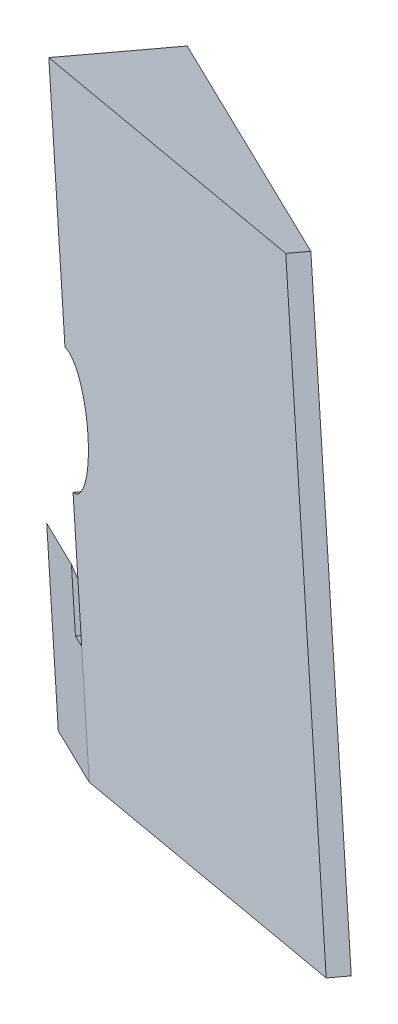
ISO-10303-21;
HEADER;
FILE_DESCRIPTION(('STEP AP214'),'2;1');
FILE_NAME('part.step','',(''),(''),'','','');
FILE_SCHEMA(('AUTOMOTIVE_DESIGN { 1 0 10303 214 1 1 1 1 }'));
ENDSEC;
DATA;
#1=APPLICATION_CONTEXT('core data for automotive mechanical design processes');
#2=APPLICATION_PROTOCOL_DEFINITION('international standard','automotive_design',2000,#1);
#3=PRODUCT_CONTEXT('',#1,'mechanical');
#4=PRODUCT('Part','Part','',(#3));
#5=PRODUCT_RELATED_PRODUCT_CATEGORY('part','',(#4));
#6=PRODUCT_DEFINITION_FORMATION('','',#4);
#7=PRODUCT_DEFINITION_CONTEXT('part definition',#1,'design');
#8=PRODUCT_DEFINITION('design','',#6,#7);
#9=PRODUCT_DEFINITION_SHAPE('','',#8);
#10=(LENGTH_UNIT() NAMED_UNIT(*) SI_UNIT(.MILLI.,.METRE.));
#11=(NAMED_UNIT(*) PLANE_ANGLE_UNIT() SI_UNIT($,.RADIAN.));
#12=(NAMED_UNIT(*) SI_UNIT($,.STERADIAN.) SOLID_ANGLE_UNIT());
#13=UNCERTAINTY_MEASURE_WITH_UNIT(LENGTH_MEASURE(1.E-05),#10,'distance_accuracy_value','');
#14=(GEOMETRIC_REPRESENTATION_CONTEXT(3) GLOBAL_UNCERTAINTY_ASSIGNED_CONTEXT((#13)) GLOBAL_UNIT_ASSIGNED_CONTEXT((#10,
#11,#12)) REPRESENTATION_CONTEXT('',''));
#15=CARTESIAN_POINT('',(0.,0.,0.));
#16=DIRECTION('',(0.,0.,1.));
#17=DIRECTION('',(1.,0.,0.));
#18=AXIS2_PLACEMENT_3D('',#15,#16,#17);
#19=CARTESIAN_POINT('',(174.868312652349,387.508814436363,117.368276724493));
#20=DIRECTION('',(0.741718760558882,0.378073109630995,0.553998198561101));
#21=DIRECTION('',(-0.598415116809022,0.,0.80118621304566));
#22=AXIS2_PLACEMENT_3D('',#19,#20,#21);
#23=PLANE('',#22);
#24=DIRECTION('',(-0.302906962959654,0.92577574162102,-0.226244664062182));
#25=VECTOR('',#24,1.);
#26=CARTESIAN_POINT('',(162.824516094883,388.577197507518,132.763963871476));
#27=LINE('',#26,#25);
#28=CARTESIAN_POINT('',(155.554748983851,410.795815306422,127.334091933984));
#29=VERTEX_POINT('',#28);
#30=CARTESIAN_POINT('',(150.708237576496,425.608227172359,123.714177308989));
#31=VERTEX_POINT('',#30);
#32=EDGE_CURVE('E205',#29,#31,#27,.T.);
#33=ORIENTED_EDGE('',*,*,#32,.T.);
#34=DIRECTION('',(0.598415116809022,0.,-0.801186213045659));
#35=VECTOR('',#34,1.);
#36=CARTESIAN_POINT('',(150.708237576496,425.608227172359,123.714177308989));
#37=LINE('',#36,#35);
#38=CARTESIAN_POINT('',(155.196350952564,425.608227172359,117.705280711146));
#39=VERTEX_POINT('',#38);
#40=EDGE_CURVE('E200',#31,#39,#37,.T.);
#41=ORIENTED_EDGE('',*,*,#40,.T.);
#42=DIRECTION('',(0.302906962959654,-0.92577574162102,0.226244664062182));
#43=VECTOR('',#42,1.);
#44=CARTESIAN_POINT('',(155.196350952564,425.608227172359,117.705280711146));
#45=LINE('',#44,#43);
#46=CARTESIAN_POINT('',(160.042862359919,410.795815306422,121.325195336141));
#47=VERTEX_POINT('',#46);
#48=EDGE_CURVE('E195',#39,#47,#45,.T.);
#49=ORIENTED_EDGE('',*,*,#48,.T.);
#50=DIRECTION('',(0.598415116809022,0.,-0.80118621304566));
#51=VECTOR('',#50,1.);
#52=CARTESIAN_POINT('',(130.122106519467,410.795815306422,161.384505988424));
#53=LINE('',#52,#51);
#54=EDGE_CURVE('E210',#29,#47,#53,.T.);
#55=ORIENTED_EDGE('',*,*,#54,.F.);
#56=EDGE_LOOP('',(#33,#41,#49,#55));
#57=FACE_BOUND('',#56,.T.);
#58=ADVANCED_FACE('F43',(#57),#23,.F.);
#59=CARTESIAN_POINT('',(181.27194031033,398.741323632892,96.6165838845008));
#60=DIRECTION('',(-0.741718760558882,-0.378073109630995,-0.553998198561101));
#61=DIRECTION('',(0.598415116809022,0.,-0.80118621304566));
#62=AXIS2_PLACEMENT_3D('',#59,#60,#61);
#63=PLANE('',#62);
#64=DIRECTION('',(0.598415116809022,0.,-0.80118621304566));
#65=VECTOR('',#64,1.);
#66=CARTESIAN_POINT('',(163.186530347356,394.575332795598,123.673236796765));
#67=LINE('',#66,#65);
#68=CARTESIAN_POINT('',(158.698416971288,394.575332795598,129.682133394607));
#69=VERTEX_POINT('',#68);
#70=CARTESIAN_POINT('',(159.559546773102,394.575332795598,128.52921244479));
#71=VERTEX_POINT('',#70);
#72=EDGE_CURVE('E174',#69,#71,#67,.T.);
#73=ORIENTED_EDGE('',*,*,#72,.T.);
#74=DIRECTION('',(-0.489309461897122,0.869944632903876,0.0614213821050018));
#75=VECTOR('',#74,1.);
#76=CARTESIAN_POINT('',(157.203115542412,398.76483833673,128.825007384996));
#77=LINE('',#76,#75);
#78=CARTESIAN_POINT('',(157.500823411103,398.235542701331,128.787637110799));
#79=VERTEX_POINT('',#78);
#80=EDGE_CURVE('E236',#71,#79,#77,.T.);
#81=ORIENTED_EDGE('',*,*,#80,.T.);
#82=DIRECTION('',(-0.302906962959654,0.92577574162102,-0.226244664062182));
#83=VECTOR('',#82,1.);
#84=CARTESIAN_POINT('',(160.970219193485,387.63201473344,131.378968375073));
#85=LINE('',#84,#83);
#86=EDGE_CURVE('E263',#69,#79,#85,.T.);
#87=ORIENTED_EDGE('',*,*,#86,.F.);
#88=EDGE_LOOP('',(#73,#81,#87));
#89=FACE_BOUND('',#88,.T.);
#90=ADVANCED_FACE('F298',(#89),#63,.F.);
#91=DIRECTION('',(-0.489309461897122,0.869944632903876,0.0614213821050018));
#92=VECTOR('',#91,1.);
#93=CARTESIAN_POINT('',(160.963068607644,398.76483833673,123.791005948625));
#94=LINE('',#93,#92);
#95=CARTESIAN_POINT('',(163.001606534753,395.140516170991,123.535115092824));
#96=VERTEX_POINT('',#95);
#97=CARTESIAN_POINT('',(160.976294698876,398.741323632892,123.789345721578));
#98=VERTEX_POINT('',#97);
#99=EDGE_CURVE('E258',#96,#98,#94,.T.);
#100=ORIENTED_EDGE('',*,*,#99,.T.);
#101=DIRECTION('',(0.598415116809022,0.,-0.80118621304566));
#102=VECTOR('',#101,1.);
#103=CARTESIAN_POINT('',(181.27194031033,398.741323632892,96.6165838845008));
#104=LINE('',#103,#102);
#105=CARTESIAN_POINT('',(160.20810220423,398.741323632892,124.817837847507));
#106=VERTEX_POINT('',#105);
#107=EDGE_CURVE('E232',#106,#98,#104,.T.);
#108=ORIENTED_EDGE('',*,*,#107,.F.);
#109=DIRECTION('',(-0.0799694138585927,0.869944632903876,-0.486622264727841));
#110=VECTOR('',#109,1.);
#111=CARTESIAN_POINT('',(159.245358804809,409.214495971897,118.959443359251));
#112=LINE('',#111,#110);
#113=CARTESIAN_POINT('',(160.591059731409,394.575332795598,127.148174537225));
#114=VERTEX_POINT('',#113);
#115=EDGE_CURVE('E171',#114,#106,#112,.T.);
#116=ORIENTED_EDGE('',*,*,#115,.F.);
#117=CARTESIAN_POINT('',(163.186530347356,394.575332795598,123.673236796765));
#118=VERTEX_POINT('',#117);
#119=EDGE_CURVE('E151',#114,#118,#67,.T.);
#120=ORIENTED_EDGE('',*,*,#119,.T.);
#121=DIRECTION('',(0.302906962959654,-0.92577574162102,0.226244664062182));
#122=VECTOR('',#121,1.);
#123=CARTESIAN_POINT('',(161.823449014037,398.741323632892,122.655135808485));
#124=LINE('',#123,#122);
#125=EDGE_CURVE('E159',#96,#118,#124,.T.);
#126=ORIENTED_EDGE('',*,*,#125,.F.);
#127=EDGE_LOOP('',(#100,#108,#116,#120,#126));
#128=FACE_BOUND('',#127,.T.);
#129=ADVANCED_FACE('F168',(#128),#63,.F.);
#130=CARTESIAN_POINT('',(173.854752704742,394.960592536583,91.0766018988898));
#131=DIRECTION('',(-0.302906962959654,0.92577574162102,-0.226244664062182));
#132=DIRECTION('',(0.741718760558882,0.378073109630995,0.553998198561101));
#133=AXIS2_PLACEMENT_3D('',#130,#131,#132);
#134=PLANE('',#133);
#135=DIRECTION('',(0.741718760558882,0.378073109630995,0.553998198561101));
#136=VECTOR('',#135,1.);
#137=CARTESIAN_POINT('',(152.790914598642,394.960592536583,119.277855861896));
#138=LINE('',#137,#136);
#139=CARTESIAN_POINT('',(152.790914598642,394.960592536583,119.277855861896));
#140=VERTEX_POINT('',#139);
#141=EDGE_CURVE('E256',#140,#106,#138,.T.);
#142=ORIENTED_EDGE('',*,*,#141,.T.);
#143=ORIENTED_EDGE('',*,*,#107,.T.);
#144=DIRECTION('',(-0.741718760558882,-0.378073109630995,-0.553998198561101));
#145=VECTOR('',#144,1.);
#146=CARTESIAN_POINT('',(153.559107093287,394.960592536583,118.249363735967));
#147=LINE('',#146,#145);
#148=CARTESIAN_POINT('',(153.559107093287,394.960592536583,118.249363735967));
#149=VERTEX_POINT('',#148);
#150=EDGE_CURVE('E260',#98,#149,#147,.T.);
#151=ORIENTED_EDGE('',*,*,#150,.T.);
#152=DIRECTION('',(0.598415116809022,0.,-0.80118621304566));
#153=VECTOR('',#152,1.);
#154=CARTESIAN_POINT('',(173.854752704742,394.960592536583,91.0766018988898));
#155=LINE('',#154,#153);
#156=EDGE_CURVE('E266',#140,#149,#155,.T.);
#157=ORIENTED_EDGE('',*,*,#156,.F.);
#158=EDGE_LOOP('',(#142,#143,#151,#157));
#159=FACE_BOUND('',#158,.T.);
#160=ADVANCED_FACE('F303',(#159),#134,.T.);
#161=CARTESIAN_POINT('',(153.553031587896,383.85128363713,125.838986389462));
#162=DIRECTION('',(-0.598415116809022,0.,0.80118621304566));
#163=DIRECTION('',(-0.741718760558882,-0.378073109630995,-0.553998198561101));
#164=AXIS2_PLACEMENT_3D('',#161,#162,#163);
#165=PLANE('',#164);
#166=DIRECTION('',(-0.741718760558882,-0.378073109630995,-0.553998198561101));
#167=VECTOR('',#166,1.);
#168=CARTESIAN_POINT('',(160.552713872685,395.520515569675,131.06712889101));
#169=LINE('',#168,#167);
#170=CARTESIAN_POINT('',(160.552713872685,395.520515569675,131.06712889101));
#171=VERTEX_POINT('',#170);
#172=EDGE_CURVE('E157',#171,#69,#169,.T.);
#173=ORIENTED_EDGE('',*,*,#172,.T.);
#174=ORIENTED_EDGE('',*,*,#86,.T.);
#175=DIRECTION('',(-0.741718760558882,-0.378073109630995,-0.553998198561101));
#176=VECTOR('',#175,1.);
#177=CARTESIAN_POINT('',(150.083635805514,394.454811605021,123.247655125188));
#178=LINE('',#177,#176);
#179=CARTESIAN_POINT('',(150.083635805514,394.454811605021,123.247655125188));
#180=VERTEX_POINT('',#179);
#181=EDGE_CURVE('E252',#79,#180,#178,.T.);
#182=ORIENTED_EDGE('',*,*,#181,.T.);
#183=DIRECTION('',(-0.302906962959654,0.92577574162102,-0.226244664062182));
#184=VECTOR('',#183,1.);
#185=CARTESIAN_POINT('',(153.553031587896,383.85128363713,125.838986389462));
#186=LINE('',#185,#184);
#187=CARTESIAN_POINT('',(153.553031587896,383.85128363713,125.838986389462));
#188=VERTEX_POINT('',#187);
#189=EDGE_CURVE('E231',#188,#180,#186,.T.);
#190=ORIENTED_EDGE('',*,*,#189,.F.);
#191=DIRECTION('',(0.741718760558882,0.378073109630995,0.553998198561101));
#192=VECTOR('',#191,1.);
#193=CARTESIAN_POINT('',(153.553031587896,383.85128363713,125.838986389462));
#194=LINE('',#193,#192);
#195=CARTESIAN_POINT('',(162.824516094881,388.577197507517,132.763963871475));
#196=VERTEX_POINT('',#195);
#197=EDGE_CURVE('E177',#188,#196,#194,.T.);
#198=ORIENTED_EDGE('',*,*,#197,.T.);
#199=DIRECTION('',(0.302906962959654,-0.92577574162102,0.226244664062182));
#200=VECTOR('',#199,1.);
#201=CARTESIAN_POINT('',(162.824516094881,388.577197507517,132.763963871475));
#202=LINE('',#201,#200);
#203=EDGE_CURVE('E274',#171,#196,#202,.T.);
#204=ORIENTED_EDGE('',*,*,#203,.F.);
#205=EDGE_LOOP('',(#173,#174,#182,#190,#198,#204));
#206=FACE_BOUND('',#205,.T.);
#207=ADVANCED_FACE('F292',(#206),#165,.T.);
#208=CARTESIAN_POINT('',(177.489636260257,383.85128363713,93.7915378676359));
#209=DIRECTION('',(0.302906962959654,-0.92577574162102,0.226244664062182));
#210=DIRECTION('',(-0.741718760558882,-0.378073109630995,-0.553998198561101));
#211=AXIS2_PLACEMENT_3D('',#208,#209,#210);
#212=PLANE('',#211);
#213=DIRECTION('',(-0.741718760558882,-0.378073109630995,-0.553998198561101));
#214=VECTOR('',#213,1.);
#215=CARTESIAN_POINT('',(167.31262947095,388.577197507518,126.755067273634));
#216=LINE('',#215,#214);
#217=CARTESIAN_POINT('',(204.398567498894,407.480852989068,154.454977201689));
#218=VERTEX_POINT('',#217);
#219=CARTESIAN_POINT('',(158.041144963964,383.85128363713,119.83008979162));
#220=VERTEX_POINT('',#219);
#221=EDGE_CURVE('E228',#218,#220,#216,.T.);
#222=ORIENTED_EDGE('',*,*,#221,.F.);
#223=DIRECTION('',(-0.598415116809022,0.,0.80118621304566));
#224=VECTOR('',#223,1.);
#225=CARTESIAN_POINT('',(204.398567498894,407.480852989068,154.454977201689));
#226=LINE('',#225,#224);
#227=CARTESIAN_POINT('',(203.584260990579,407.480852989068,155.545208931017));
#228=VERTEX_POINT('',#227);
#229=EDGE_CURVE('E198',#218,#228,#226,.T.);
#230=ORIENTED_EDGE('',*,*,#229,.T.);
#231=DIRECTION('',(-0.809118558762118,-0.375255010003312,-0.452228742268917));
#232=VECTOR('',#231,1.);
#233=CARTESIAN_POINT('',(156.730192098101,385.750756823875,129.357752944538));
#234=LINE('',#233,#232);
#235=EDGE_CURVE('E51',#196,#228,#234,.F.);
#236=ORIENTED_EDGE('',*,*,#235,.F.);
#237=ORIENTED_EDGE('',*,*,#197,.F.);
#238=DIRECTION('',(-0.598415116809022,0.,0.80118621304566));
#239=VECTOR('',#238,1.);
#240=CARTESIAN_POINT('',(177.489636260257,383.85128363713,93.7915378676359));
#241=LINE('',#240,#239);
#242=EDGE_CURVE('E221',#220,#188,#241,.T.);
#243=ORIENTED_EDGE('',*,*,#242,.F.);
#244=EDGE_LOOP('',(#222,#230,#236,#237,#243));
#245=FACE_BOUND('',#244,.T.);
#246=ADVANCED_FACE('F227',(#245),#212,.T.);
#247=CARTESIAN_POINT('',(173.854752704742,394.960592536583,91.0766018988898));
#248=DIRECTION('',(-0.741718760558882,-0.378073109630995,-0.553998198561101));
#249=DIRECTION('',(0.598415116809022,0.,-0.80118621304566));
#250=AXIS2_PLACEMENT_3D('',#247,#248,#249);
#251=PLANE('',#250);
#252=DIRECTION('',(0.302906962959654,-0.92577574162102,0.226244664062182));
#253=VECTOR('',#252,1.);
#254=CARTESIAN_POINT('',(154.406261408448,394.960592536583,117.115153822874));
#255=LINE('',#254,#253);
#256=CARTESIAN_POINT('',(155.584418929164,391.359785074681,117.995133107213));
#257=VERTEX_POINT('',#256);
#258=EDGE_CURVE('E166',#257,#220,#255,.T.);
#259=ORIENTED_EDGE('',*,*,#258,.T.);
#260=ORIENTED_EDGE('',*,*,#242,.T.);
#261=ORIENTED_EDGE('',*,*,#189,.T.);
#262=DIRECTION('',(-0.489309461897122,0.869944632903876,0.0614213821050018));
#263=VECTOR('',#262,1.);
#264=CARTESIAN_POINT('',(149.785927936823,394.98410724042,123.285025399385));
#265=LINE('',#264,#263);
#266=CARTESIAN_POINT('',(152.142359167513,390.794601699288,122.989230459179));
#267=VERTEX_POINT('',#266);
#268=EDGE_CURVE('E247',#267,#180,#265,.T.);
#269=ORIENTED_EDGE('',*,*,#268,.F.);
#270=DIRECTION('',(-0.598415116809022,0.,0.80118621304566));
#271=VECTOR('',#270,1.);
#272=CARTESIAN_POINT('',(152.142359167513,390.794601699288,122.989230459179));
#273=LINE('',#272,#271);
#274=CARTESIAN_POINT('',(153.17387212582,390.794601699288,121.608192551614));
#275=VERTEX_POINT('',#274);
#276=EDGE_CURVE('E244',#275,#267,#273,.T.);
#277=ORIENTED_EDGE('',*,*,#276,.F.);
#278=DIRECTION('',(0.0799694138585927,-0.869944632903876,0.486622264727841));
#279=VECTOR('',#278,1.);
#280=CARTESIAN_POINT('',(152.788753016155,394.98410724042,119.264702405914));
#281=LINE('',#280,#279);
#282=EDGE_CURVE('E238',#140,#275,#281,.T.);
#283=ORIENTED_EDGE('',*,*,#282,.F.);
#284=ORIENTED_EDGE('',*,*,#156,.T.);
#285=DIRECTION('',(-0.489309461897122,0.869944632903876,0.0614213821050018));
#286=VECTOR('',#285,1.);
#287=CARTESIAN_POINT('',(153.545881002055,394.98410724042,118.251023963014));
#288=LINE('',#287,#286);
#289=EDGE_CURVE('E224',#257,#149,#288,.T.);
#290=ORIENTED_EDGE('',*,*,#289,.F.);
#291=EDGE_LOOP('',(#259,#260,#261,#269,#277,#283,#284,#290));
#292=FACE_BOUND('',#291,.T.);
#293=ADVANCED_FACE('F219',(#292),#251,.T.);
#294=CARTESIAN_POINT('',(153.545881002055,394.98410724042,118.251023963014));
#295=DIRECTION('',(-0.458725986546375,-0.316633951836643,0.830249004703629));
#296=DIRECTION('',(-0.489309461897122,0.869944632903876,0.0614213821050018));
#297=AXIS2_PLACEMENT_3D('',#294,#295,#296);
#298=PLANE('',#297);
#299=ORIENTED_EDGE('',*,*,#289,.T.);
#300=ORIENTED_EDGE('',*,*,#150,.F.);
#301=ORIENTED_EDGE('',*,*,#99,.F.);
#302=DIRECTION('',(0.741718760558882,0.378073109630995,0.553998198561101));
#303=VECTOR('',#302,1.);
#304=CARTESIAN_POINT('',(155.584418929164,391.359785074681,117.995133107213));
#305=LINE('',#304,#303);
#306=EDGE_CURVE('E58',#257,#96,#305,.T.);
#307=ORIENTED_EDGE('',*,*,#306,.F.);
#308=EDGE_LOOP('',(#299,#300,#301,#307));
#309=FACE_BOUND('',#308,.T.);
#310=ADVANCED_FACE('F306',(#309),#298,.F.);
#311=CARTESIAN_POINT('',(152.788753016155,394.98410724042,119.264702405914));
#312=DIRECTION('',(0.665926552317978,-0.316633951836643,-0.675488539845201));
#313=DIRECTION('',(0.0799694138585927,-0.869944632903876,0.486622264727841));
#314=AXIS2_PLACEMENT_3D('',#311,#312,#313);
#315=PLANE('',#314);
#316=ORIENTED_EDGE('',*,*,#141,.F.);
#317=ORIENTED_EDGE('',*,*,#282,.T.);
#318=DIRECTION('',(0.741718760558882,0.378073109630995,0.553998198561101));
#319=VECTOR('',#318,1.);
#320=CARTESIAN_POINT('',(153.17387212582,390.794601699288,121.608192551614));
#321=LINE('',#320,#319);
#322=EDGE_CURVE('E248',#275,#114,#321,.T.);
#323=ORIENTED_EDGE('',*,*,#322,.T.);
#324=ORIENTED_EDGE('',*,*,#115,.T.);
#325=EDGE_LOOP('',(#316,#317,#323,#324));
#326=FACE_BOUND('',#325,.T.);
#327=ADVANCED_FACE('F304',(#326),#315,.F.);
#328=CARTESIAN_POINT('',(149.785927936823,394.98410724042,123.285025399385));
#329=DIRECTION('',(-0.458725986546375,-0.316633951836643,0.830249004703629));
#330=DIRECTION('',(-0.489309461897122,0.869944632903876,0.0614213821050018));
#331=AXIS2_PLACEMENT_3D('',#328,#329,#330);
#332=PLANE('',#331);
#333=ORIENTED_EDGE('',*,*,#181,.F.);
#334=ORIENTED_EDGE('',*,*,#80,.F.);
#335=DIRECTION('',(0.741718760558882,0.378073109630995,0.553998198561101));
#336=VECTOR('',#335,1.);
#337=CARTESIAN_POINT('',(152.142359167513,390.794601699288,122.989230459179));
#338=LINE('',#337,#336);
#339=EDGE_CURVE('E250',#267,#71,#338,.T.);
#340=ORIENTED_EDGE('',*,*,#339,.F.);
#341=ORIENTED_EDGE('',*,*,#268,.T.);
#342=EDGE_LOOP('',(#333,#334,#340,#341));
#343=FACE_BOUND('',#342,.T.);
#344=ADVANCED_FACE('F297',(#343),#332,.F.);
#345=CARTESIAN_POINT('',(152.142359167513,390.794601699288,122.989230459179));
#346=DIRECTION('',(0.302906962959654,-0.92577574162102,0.226244664062182));
#347=DIRECTION('',(-0.741718760558882,-0.378073109630995,-0.553998198561101));
#348=AXIS2_PLACEMENT_3D('',#345,#346,#347);
#349=PLANE('',#348);
#350=ORIENTED_EDGE('',*,*,#322,.F.);
#351=ORIENTED_EDGE('',*,*,#276,.T.);
#352=ORIENTED_EDGE('',*,*,#339,.T.);
#353=ORIENTED_EDGE('',*,*,#72,.F.);
#354=ORIENTED_EDGE('',*,*,#172,.F.);
#355=DIRECTION('',(0.598415116809022,0.,-0.80118621304566));
#356=VECTOR('',#355,1.);
#357=CARTESIAN_POINT('',(165.040827248753,395.520515569675,125.058232293167));
#358=LINE('',#357,#356);
#359=CARTESIAN_POINT('',(165.040827248753,395.520515569675,125.058232293167));
#360=VERTEX_POINT('',#359);
#361=EDGE_CURVE('E155',#171,#360,#358,.T.);
#362=ORIENTED_EDGE('',*,*,#361,.T.);
#363=DIRECTION('',(-0.741718760558882,-0.378073109630995,-0.553998198561101));
#364=VECTOR('',#363,1.);
#365=CARTESIAN_POINT('',(165.040827248753,395.520515569675,125.058232293167));
#366=LINE('',#365,#364);
#367=EDGE_CURVE('E148',#360,#118,#366,.T.);
#368=ORIENTED_EDGE('',*,*,#367,.T.);
#369=ORIENTED_EDGE('',*,*,#119,.F.);
#370=EDGE_LOOP('',(#350,#351,#352,#353,#354,#362,#368,#369));
#371=FACE_BOUND('',#370,.T.);
#372=ADVANCED_FACE('F149',(#371),#349,.F.);
#373=CARTESIAN_POINT('',(165.040827248753,395.520515569675,125.058232293167));
#374=DIRECTION('',(-0.598415116809022,0.,0.80118621304566));
#375=DIRECTION('',(-0.741718760558882,-0.378073109630995,-0.553998198561101));
#376=AXIS2_PLACEMENT_3D('',#373,#374,#375);
#377=PLANE('',#376);
#378=ORIENTED_EDGE('',*,*,#221,.T.);
#379=ORIENTED_EDGE('',*,*,#258,.F.);
#380=ORIENTED_EDGE('',*,*,#306,.T.);
#381=ORIENTED_EDGE('',*,*,#125,.T.);
#382=ORIENTED_EDGE('',*,*,#367,.F.);
#383=CARTESIAN_POINT('',(162.466118063596,403.389609373454,123.135152648639));
#384=VERTEX_POINT('',#383);
#385=EDGE_CURVE('E199',#384,#360,#45,.T.);
#386=ORIENTED_EDGE('',*,*,#385,.F.);
#387=CARTESIAN_POINT('',(161.254490211757,407.092712339938,122.23017399239));
#388=DIRECTION('',(-0.598415116809022,0.,0.80118621304566));
#389=DIRECTION('',(0.741718760558882,0.378073109630995,0.553998198561101));
#390=AXIS2_PLACEMENT_3D('',#387,#388,#389);
#391=CIRCLE('',#390,4.);
#392=EDGE_CURVE('E165',#384,#47,#391,.T.);
#393=ORIENTED_EDGE('',*,*,#392,.T.);
#394=ORIENTED_EDGE('',*,*,#48,.F.);
#395=DIRECTION('',(-0.741718760558882,-0.378073109630995,-0.553998198561101));
#396=VECTOR('',#395,1.);
#397=CARTESIAN_POINT('',(192.282288980508,444.511882653908,145.405190639201));
#398=LINE('',#397,#396);
#399=CARTESIAN_POINT('',(192.282288980508,444.511882653908,145.405190639201));
#400=VERTEX_POINT('',#399);
#401=EDGE_CURVE('E181',#400,#39,#398,.T.);
#402=ORIENTED_EDGE('',*,*,#401,.F.);
#403=DIRECTION('',(0.302906962959654,-0.92577574162102,0.226244664062182));
#404=VECTOR('',#403,1.);
#405=CARTESIAN_POINT('',(192.282288980508,444.511882653908,145.405190639201));
#406=LINE('',#405,#404);
#407=EDGE_CURVE('E186',#400,#218,#406,.T.);
#408=ORIENTED_EDGE('',*,*,#407,.T.);
#409=EDGE_LOOP('',(#378,#379,#380,#381,#382,#386,#393,#394,#402,#408));
#410=FACE_BOUND('',#409,.T.);
#411=ADVANCED_FACE('F161',(#410),#377,.F.);
#412=ORIENTED_EDGE('',*,*,#385,.T.);
#413=ORIENTED_EDGE('',*,*,#361,.F.);
#414=CARTESIAN_POINT('',(157.978004687528,403.389609373454,129.144049246481));
#415=VERTEX_POINT('',#414);
#416=EDGE_CURVE('E203',#171,#415,#27,.T.);
#417=ORIENTED_EDGE('',*,*,#416,.T.);
#418=DIRECTION('',(0.598415116809022,0.,-0.80118621304566));
#419=VECTOR('',#418,1.);
#420=CARTESIAN_POINT('',(132.545362223145,403.389609373454,163.194463300922));
#421=LINE('',#420,#419);
#422=EDGE_CURVE('E212',#384,#415,#421,.F.);
#423=ORIENTED_EDGE('',*,*,#422,.F.);
#424=EDGE_LOOP('',(#412,#413,#417,#423));
#425=FACE_BOUND('',#424,.T.);
#426=ADVANCED_FACE('F290',(#425),#23,.F.);
#427=CARTESIAN_POINT('',(187.79417560444,444.511882653908,151.414087237044));
#428=DIRECTION('',(0.302906962959653,-0.92577574162102,0.226244664062183));
#429=DIRECTION('',(-0.598415116809022,0.,0.801186213045659));
#430=AXIS2_PLACEMENT_3D('',#427,#428,#429);
#431=PLANE('',#430);
#432=DIRECTION('',(0.598415116809022,0.,-0.801186213045659));
#433=VECTOR('',#432,1.);
#434=CARTESIAN_POINT('',(187.79417560444,444.511882653908,151.414087237044));
#435=LINE('',#434,#433);
#436=CARTESIAN_POINT('',(191.467982472193,444.511882653908,146.49542236853));
#437=VERTEX_POINT('',#436);
#438=EDGE_CURVE('E192',#437,#400,#435,.T.);
#439=ORIENTED_EDGE('',*,*,#438,.T.);
#440=ORIENTED_EDGE('',*,*,#401,.T.);
#441=ORIENTED_EDGE('',*,*,#40,.F.);
#442=DIRECTION('',(0.809118558762118,0.375255010003312,0.452228742268917));
#443=VECTOR('',#442,1.);
#444=CARTESIAN_POINT('',(191.467982472193,444.511882653908,146.49542236853));
#445=LINE('',#444,#443);
#446=EDGE_CURVE('E175',#437,#31,#445,.F.);
#447=ORIENTED_EDGE('',*,*,#446,.F.);
#448=EDGE_LOOP('',(#439,#440,#441,#447));
#449=FACE_BOUND('',#448,.T.);
#450=ADVANCED_FACE('F283',(#449),#431,.F.);
#451=CARTESIAN_POINT('',(211.954250680293,406.412469917913,145.068186652548));
#452=DIRECTION('',(0.741718760558882,0.378073109630995,0.553998198561101));
#453=DIRECTION('',(-0.598415116809022,0.,0.80118621304566));
#454=AXIS2_PLACEMENT_3D('',#451,#452,#453);
#455=PLANE('',#454);
#456=ORIENTED_EDGE('',*,*,#229,.F.);
#457=ORIENTED_EDGE('',*,*,#407,.F.);
#458=ORIENTED_EDGE('',*,*,#438,.F.);
#459=DIRECTION('',(-0.302906962959654,0.92577574162102,-0.226244664062182));
#460=VECTOR('',#459,1.);
#461=CARTESIAN_POINT('',(203.933828015088,406.412469917913,155.80630452702));
#462=LINE('',#461,#460);
#463=EDGE_CURVE('E172',#228,#437,#462,.T.);
#464=ORIENTED_EDGE('',*,*,#463,.F.);
#465=EDGE_LOOP('',(#456,#457,#458,#464));
#466=FACE_BOUND('',#465,.T.);
#467=ADVANCED_FACE('F281',(#466),#455,.T.);
#468=CARTESIAN_POINT('',(203.933828015088,406.412469917913,155.80630452702));
#469=DIRECTION('',(0.503561842932198,-0.0460755216298706,-0.862729689212829));
#470=DIRECTION('',(-0.302906962959654,0.92577574162102,-0.226244664062182));
#471=AXIS2_PLACEMENT_3D('',#468,#469,#470);
#472=PLANE('',#471);
#473=CARTESIAN_POINT('',(156.76637683569,407.092712339938,128.239070590232));
#474=DIRECTION('',(-0.503561842932198,0.0460755216298706,0.862729689212829));
#475=DIRECTION('',(0.809118558762118,0.375255010003312,0.452228742268917));
#476=AXIS2_PLACEMENT_3D('',#473,#474,#475);
#477=ELLIPSE('',#476,4.03003930183539,4.);
#478=EDGE_CURVE('E11',#29,#415,#477,.F.);
#479=ORIENTED_EDGE('',*,*,#478,.T.);
#480=ORIENTED_EDGE('',*,*,#416,.F.);
#481=ORIENTED_EDGE('',*,*,#203,.T.);
#482=ORIENTED_EDGE('',*,*,#235,.T.);
#483=ORIENTED_EDGE('',*,*,#463,.T.);
#484=ORIENTED_EDGE('',*,*,#446,.T.);
#485=ORIENTED_EDGE('',*,*,#32,.F.);
#486=EDGE_LOOP('',(#479,#480,#481,#482,#483,#484,#485));
#487=FACE_BOUND('',#486,.T.);
#488=ADVANCED_FACE('F45',(#487),#472,.F.);
#489=CARTESIAN_POINT('',(131.333734371306,407.092712339938,162.289484644673));
#490=DIRECTION('',(0.598415116809022,0.,-0.80118621304566));
#491=DIRECTION('',(0.741718760558882,0.378073109630995,0.553998198561101));
#492=AXIS2_PLACEMENT_3D('',#489,#490,#491);
#493=CYLINDRICAL_SURFACE('',#492,4.);
#494=ORIENTED_EDGE('',*,*,#478,.F.);
#495=ORIENTED_EDGE('',*,*,#54,.T.);
#496=ORIENTED_EDGE('',*,*,#392,.F.);
#497=ORIENTED_EDGE('',*,*,#422,.T.);
#498=EDGE_LOOP('',(#494,#495,#496,#497));
#499=FACE_BOUND('',#498,.T.);
#500=ADVANCED_FACE('F288',(#499),#493,.F.);
#501=CLOSED_SHELL('',(#58,#90,#129,#160,#207,#246,#293,#310,#327,#344,#372,#411,#426,#450,#467,
#488,#500));
#502=MANIFOLD_SOLID_BREP('B2',#501);
#503=ADVANCED_BREP_SHAPE_REPRESENTATION('',(#18,#502),#14);
#504=SHAPE_DEFINITION_REPRESENTATION(#9,#503);
ENDSEC;
END-ISO-10303-21;
